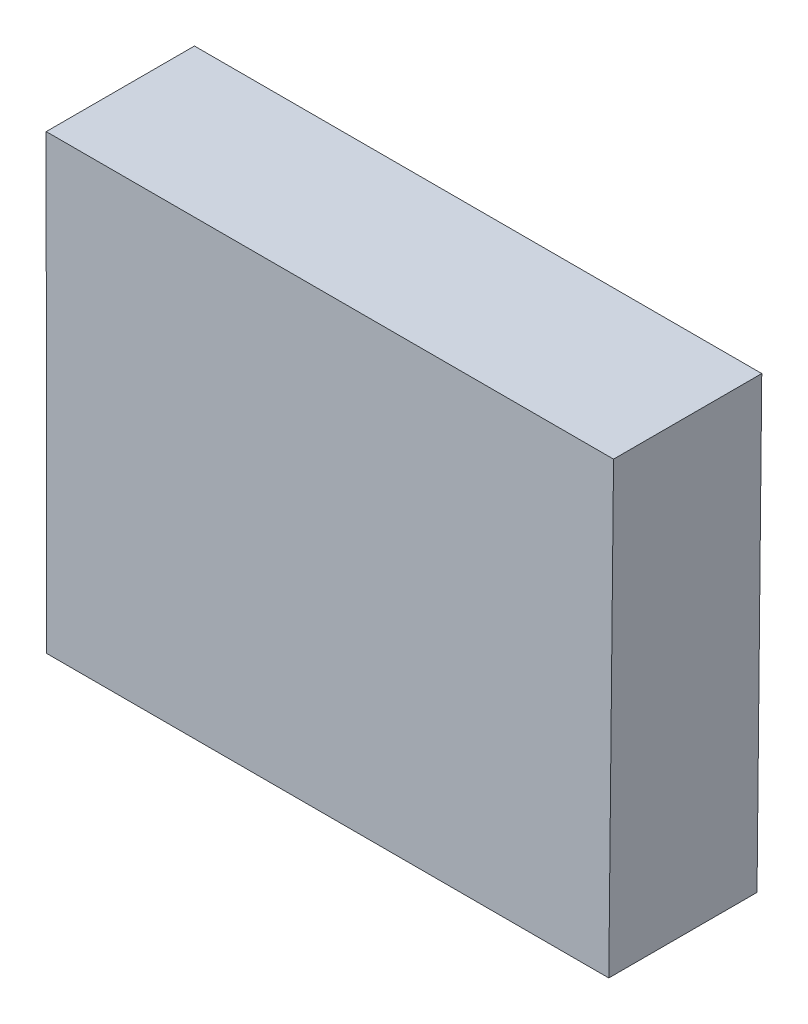
ISO-10303-21;
HEADER;
FILE_DESCRIPTION(('STEP AP214'),'2;1');
FILE_NAME('part.step','',(''),(''),'','','');
FILE_SCHEMA(('AUTOMOTIVE_DESIGN { 1 0 10303 214 1 1 1 1 }'));
ENDSEC;
DATA;
#1=APPLICATION_CONTEXT('core data for automotive mechanical design processes');
#2=APPLICATION_PROTOCOL_DEFINITION('international standard','automotive_design',2000,#1);
#3=PRODUCT_CONTEXT('',#1,'mechanical');
#4=PRODUCT('Part','Part','',(#3));
#5=PRODUCT_RELATED_PRODUCT_CATEGORY('part','',(#4));
#6=PRODUCT_DEFINITION_FORMATION('','',#4);
#7=PRODUCT_DEFINITION_CONTEXT('part definition',#1,'design');
#8=PRODUCT_DEFINITION('design','',#6,#7);
#9=PRODUCT_DEFINITION_SHAPE('','',#8);
#10=(LENGTH_UNIT() NAMED_UNIT(*) SI_UNIT(.MILLI.,.METRE.));
#11=(NAMED_UNIT(*) PLANE_ANGLE_UNIT() SI_UNIT($,.RADIAN.));
#12=(NAMED_UNIT(*) SI_UNIT($,.STERADIAN.) SOLID_ANGLE_UNIT());
#13=UNCERTAINTY_MEASURE_WITH_UNIT(LENGTH_MEASURE(1.E-05),#10,'distance_accuracy_value','');
#14=(GEOMETRIC_REPRESENTATION_CONTEXT(3) GLOBAL_UNCERTAINTY_ASSIGNED_CONTEXT((#13)) GLOBAL_UNIT_ASSIGNED_CONTEXT((#10,
#11,#12)) REPRESENTATION_CONTEXT('',''));
#15=CARTESIAN_POINT('',(0.,0.,0.));
#16=DIRECTION('',(0.,0.,1.));
#17=DIRECTION('',(1.,0.,0.));
#18=AXIS2_PLACEMENT_3D('',#15,#16,#17);
#19=CARTESIAN_POINT('',(1.524,-1.23420124,0.81000092));
#20=DIRECTION('',(0.,0.,-1.));
#21=DIRECTION('',(-1.,0.,0.));
#22=AXIS2_PLACEMENT_3D('',#19,#20,#21);
#23=PLANE('',#22);
#24=DIRECTION('',(1.,0.,0.));
#25=VECTOR('',#24,1.);
#26=CARTESIAN_POINT('',(1.55000198,1.23420124,0.81000092));
#27=LINE('',#26,#25);
#28=CARTESIAN_POINT('',(1.55000198,1.23420124,0.81000092));
#29=VERTEX_POINT('',#28);
#30=CARTESIAN_POINT('',(-1.54999944,1.23420124,0.81000092));
#31=VERTEX_POINT('',#30);
#32=EDGE_CURVE('E55',#29,#31,#27,.F.);
#33=ORIENTED_EDGE('',*,*,#32,.T.);
#34=DIRECTION('',(-0.000242845316832818,0.999999970513076,0.));
#35=VECTOR('',#34,1.);
#36=CARTESIAN_POINT('',(-1.54999944,1.23420124,0.81000092));
#37=LINE('',#36,#35);
#38=CARTESIAN_POINT('',(-1.5494,-1.23420124,0.81000092));
#39=VERTEX_POINT('',#38);
#40=EDGE_CURVE('E57',#31,#39,#37,.F.);
#41=ORIENTED_EDGE('',*,*,#40,.T.);
#42=DIRECTION('',(1.,0.,0.));
#43=VECTOR('',#42,1.);
#44=CARTESIAN_POINT('',(-1.5494,-1.23420124,0.81000092));
#45=LINE('',#44,#43);
#46=CARTESIAN_POINT('',(1.524,-1.23420124,0.81000092));
#47=VERTEX_POINT('',#46);
#48=EDGE_CURVE('E20',#39,#47,#45,.T.);
#49=ORIENTED_EDGE('',*,*,#48,.T.);
#50=DIRECTION('',(-0.0105333460377275,-0.999944522771763,0.));
#51=VECTOR('',#50,1.);
#52=CARTESIAN_POINT('',(1.524,-1.23420124,0.81000092));
#53=LINE('',#52,#51);
#54=EDGE_CURVE('E80',#47,#29,#53,.F.);
#55=ORIENTED_EDGE('',*,*,#54,.T.);
#56=EDGE_LOOP('',(#33,#41,#49,#55));
#57=FACE_BOUND('',#56,.T.);
#58=ADVANCED_FACE('F17',(#57),#23,.F.);
#59=CARTESIAN_POINT('',(-1.5494,-1.23420124,0.));
#60=DIRECTION('',(0.,1.,0.));
#61=DIRECTION('',(0.,0.,1.));
#62=AXIS2_PLACEMENT_3D('',#59,#60,#61);
#63=PLANE('',#62);
#64=DIRECTION('',(0.,0.,1.));
#65=VECTOR('',#64,1.);
#66=CARTESIAN_POINT('',(1.524,-1.23420124,0.));
#67=LINE('',#66,#65);
#68=CARTESIAN_POINT('',(1.524,-1.23420124,0.));
#69=VERTEX_POINT('',#68);
#70=EDGE_CURVE('E68',#69,#47,#67,.T.);
#71=ORIENTED_EDGE('',*,*,#70,.T.);
#72=ORIENTED_EDGE('',*,*,#48,.F.);
#73=DIRECTION('',(0.,0.,1.));
#74=VECTOR('',#73,1.);
#75=CARTESIAN_POINT('',(-1.5494,-1.23420124,0.));
#76=LINE('',#75,#74);
#77=CARTESIAN_POINT('',(-1.5494,-1.23420124,0.));
#78=VERTEX_POINT('',#77);
#79=EDGE_CURVE('E63',#39,#78,#76,.F.);
#80=ORIENTED_EDGE('',*,*,#79,.T.);
#81=DIRECTION('',(-1.,0.,0.));
#82=VECTOR('',#81,1.);
#83=CARTESIAN_POINT('',(1.524,-1.23420124,0.));
#84=LINE('',#83,#82);
#85=EDGE_CURVE('E83',#69,#78,#84,.T.);
#86=ORIENTED_EDGE('',*,*,#85,.F.);
#87=EDGE_LOOP('',(#71,#72,#80,#86));
#88=FACE_BOUND('',#87,.T.);
#89=ADVANCED_FACE('F65',(#88),#63,.F.);
#90=CARTESIAN_POINT('',(-1.54999944,1.23420124,0.));
#91=DIRECTION('',(0.999999970513076,0.000242845316832818,0.));
#92=DIRECTION('',(-0.000242845316832818,0.999999970513076,0.));
#93=AXIS2_PLACEMENT_3D('',#90,#91,#92);
#94=PLANE('',#93);
#95=ORIENTED_EDGE('',*,*,#79,.F.);
#96=ORIENTED_EDGE('',*,*,#40,.F.);
#97=DIRECTION('',(0.,0.,-1.));
#98=VECTOR('',#97,1.);
#99=CARTESIAN_POINT('',(-1.54999944,1.23420124,0.));
#100=LINE('',#99,#98);
#101=CARTESIAN_POINT('',(-1.54999944,1.23420124,0.));
#102=VERTEX_POINT('',#101);
#103=EDGE_CURVE('E75',#31,#102,#100,.T.);
#104=ORIENTED_EDGE('',*,*,#103,.T.);
#105=DIRECTION('',(-0.000242845316831935,0.999999970513076,0.));
#106=VECTOR('',#105,1.);
#107=CARTESIAN_POINT('',(-1.5494,-1.23420124,0.));
#108=LINE('',#107,#106);
#109=EDGE_CURVE('E72',#78,#102,#108,.T.);
#110=ORIENTED_EDGE('',*,*,#109,.F.);
#111=EDGE_LOOP('',(#95,#96,#104,#110));
#112=FACE_BOUND('',#111,.T.);
#113=ADVANCED_FACE('F70',(#112),#94,.F.);
#114=CARTESIAN_POINT('',(1.55000198,1.23420124,0.));
#115=DIRECTION('',(0.,-1.,0.));
#116=DIRECTION('',(0.,0.,-1.));
#117=AXIS2_PLACEMENT_3D('',#114,#115,#116);
#118=PLANE('',#117);
#119=ORIENTED_EDGE('',*,*,#103,.F.);
#120=ORIENTED_EDGE('',*,*,#32,.F.);
#121=DIRECTION('',(0.,0.,1.));
#122=VECTOR('',#121,1.);
#123=CARTESIAN_POINT('',(1.55000198,1.23420124,0.));
#124=LINE('',#123,#122);
#125=CARTESIAN_POINT('',(1.55000198,1.23420124,0.));
#126=VERTEX_POINT('',#125);
#127=EDGE_CURVE('E35',#29,#126,#124,.F.);
#128=ORIENTED_EDGE('',*,*,#127,.T.);
#129=DIRECTION('',(-1.,0.,0.));
#130=VECTOR('',#129,1.);
#131=CARTESIAN_POINT('',(1.524,1.23420124,0.));
#132=LINE('',#131,#130);
#133=EDGE_CURVE('E26',#102,#126,#132,.F.);
#134=ORIENTED_EDGE('',*,*,#133,.F.);
#135=EDGE_LOOP('',(#119,#120,#128,#134));
#136=FACE_BOUND('',#135,.T.);
#137=ADVANCED_FACE('F89',(#136),#118,.F.);
#138=CARTESIAN_POINT('',(1.524,-1.23420124,0.));
#139=DIRECTION('',(-0.999944522771763,0.0105333460377275,0.));
#140=DIRECTION('',(-0.0105333460377275,-0.999944522771763,0.));
#141=AXIS2_PLACEMENT_3D('',#138,#139,#140);
#142=PLANE('',#141);
#143=ORIENTED_EDGE('',*,*,#127,.F.);
#144=ORIENTED_EDGE('',*,*,#54,.F.);
#145=ORIENTED_EDGE('',*,*,#70,.F.);
#146=DIRECTION('',(-0.010533346037726,-0.999944522771763,0.));
#147=VECTOR('',#146,1.);
#148=CARTESIAN_POINT('',(1.55000198,1.23420124,0.));
#149=LINE('',#148,#147);
#150=EDGE_CURVE('E11',#126,#69,#149,.T.);
#151=ORIENTED_EDGE('',*,*,#150,.F.);
#152=EDGE_LOOP('',(#143,#144,#145,#151));
#153=FACE_BOUND('',#152,.T.);
#154=ADVANCED_FACE('F91',(#153),#142,.F.);
#155=CARTESIAN_POINT('',(1.524,-1.23420124,0.));
#156=DIRECTION('',(0.,0.,-1.));
#157=DIRECTION('',(-1.,0.,0.));
#158=AXIS2_PLACEMENT_3D('',#155,#156,#157);
#159=PLANE('',#158);
#160=ORIENTED_EDGE('',*,*,#133,.T.);
#161=ORIENTED_EDGE('',*,*,#150,.T.);
#162=ORIENTED_EDGE('',*,*,#85,.T.);
#163=ORIENTED_EDGE('',*,*,#109,.T.);
#164=EDGE_LOOP('',(#160,#161,#162,#163));
#165=FACE_BOUND('',#164,.T.);
#166=ADVANCED_FACE('F88',(#165),#159,.T.);
#167=CLOSED_SHELL('',(#58,#89,#113,#137,#154,#166));
#168=MANIFOLD_SOLID_BREP('B1',#167);
#169=ADVANCED_BREP_SHAPE_REPRESENTATION('',(#18,#168),#14);
#170=SHAPE_DEFINITION_REPRESENTATION(#9,#169);
ENDSEC;
END-ISO-10303-21;
